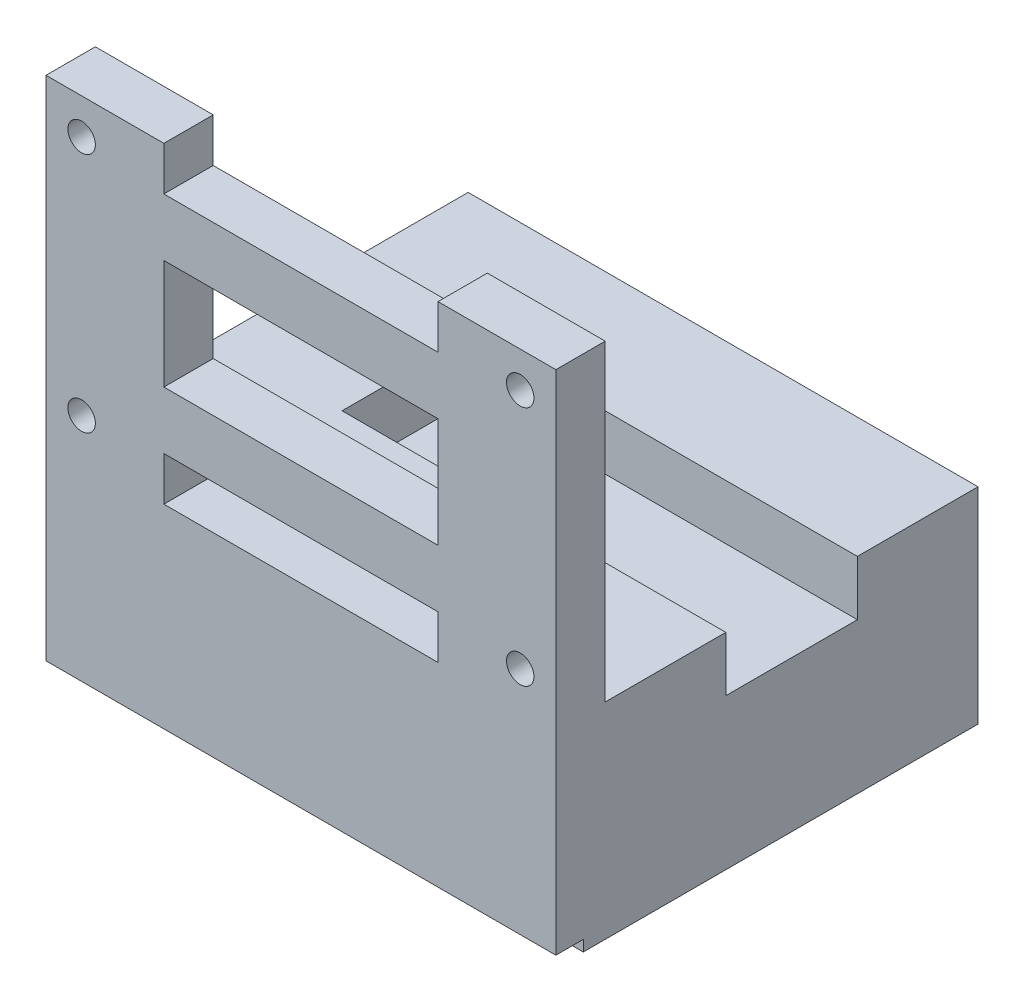
ISO-10303-21;
HEADER;
FILE_DESCRIPTION(('STEP AP214'),'2;1');
FILE_NAME('part.step','',(''),(''),'','','');
FILE_SCHEMA(('AUTOMOTIVE_DESIGN { 1 0 10303 214 1 1 1 1 }'));
ENDSEC;
DATA;
#1=APPLICATION_CONTEXT('core data for automotive mechanical design processes');
#2=APPLICATION_PROTOCOL_DEFINITION('international standard','automotive_design',2000,#1);
#3=PRODUCT_CONTEXT('',#1,'mechanical');
#4=PRODUCT('Part','Part','',(#3));
#5=PRODUCT_RELATED_PRODUCT_CATEGORY('part','',(#4));
#6=PRODUCT_DEFINITION_FORMATION('','',#4);
#7=PRODUCT_DEFINITION_CONTEXT('part definition',#1,'design');
#8=PRODUCT_DEFINITION('design','',#6,#7);
#9=PRODUCT_DEFINITION_SHAPE('','',#8);
#10=(LENGTH_UNIT() NAMED_UNIT(*) SI_UNIT(.MILLI.,.METRE.));
#11=(NAMED_UNIT(*) PLANE_ANGLE_UNIT() SI_UNIT($,.RADIAN.));
#12=(NAMED_UNIT(*) SI_UNIT($,.STERADIAN.) SOLID_ANGLE_UNIT());
#13=UNCERTAINTY_MEASURE_WITH_UNIT(LENGTH_MEASURE(1.E-05),#10,'distance_accuracy_value','');
#14=(GEOMETRIC_REPRESENTATION_CONTEXT(3) GLOBAL_UNCERTAINTY_ASSIGNED_CONTEXT((#13)) GLOBAL_UNIT_ASSIGNED_CONTEXT((#10,
#11,#12)) REPRESENTATION_CONTEXT('',''));
#15=CARTESIAN_POINT('',(0.,0.,0.));
#16=DIRECTION('',(0.,0.,1.));
#17=DIRECTION('',(1.,0.,0.));
#18=AXIS2_PLACEMENT_3D('',#15,#16,#17);
#19=CARTESIAN_POINT('',(-23.25,42.25,19.));
#20=DIRECTION('',(0.,-1.,0.));
#21=DIRECTION('',(0.,0.,-1.));
#22=AXIS2_PLACEMENT_3D('',#19,#20,#21);
#23=PLANE('',#22);
#24=DIRECTION('',(-1.,0.,0.));
#25=VECTOR('',#24,1.);
#26=CARTESIAN_POINT('',(-23.25,42.25,17.));
#27=LINE('',#26,#25);
#28=CARTESIAN_POINT('',(23.25,42.25,17.));
#29=VERTEX_POINT('',#28);
#30=CARTESIAN_POINT('',(12.5,42.25,17.));
#31=VERTEX_POINT('',#30);
#32=EDGE_CURVE('E504',#29,#31,#27,.T.);
#33=ORIENTED_EDGE('',*,*,#32,.T.);
#34=DIRECTION('',(0.,0.,-1.));
#35=VECTOR('',#34,1.);
#36=CARTESIAN_POINT('',(12.5,42.25,27.));
#37=LINE('',#36,#35);
#38=CARTESIAN_POINT('',(12.5,42.25,21.5));
#39=VERTEX_POINT('',#38);
#40=EDGE_CURVE('E329',#39,#31,#37,.T.);
#41=ORIENTED_EDGE('',*,*,#40,.F.);
#42=DIRECTION('',(-1.,0.,0.));
#43=VECTOR('',#42,1.);
#44=CARTESIAN_POINT('',(23.25,42.25,21.5));
#45=LINE('',#44,#43);
#46=CARTESIAN_POINT('',(23.25,42.25,21.5));
#47=VERTEX_POINT('',#46);
#48=EDGE_CURVE('E385',#47,#39,#45,.T.);
#49=ORIENTED_EDGE('',*,*,#48,.F.);
#50=DIRECTION('',(0.,0.,-1.));
#51=VECTOR('',#50,1.);
#52=CARTESIAN_POINT('',(23.25,42.25,19.));
#53=LINE('',#52,#51);
#54=EDGE_CURVE('E520',#47,#29,#53,.T.);
#55=ORIENTED_EDGE('',*,*,#54,.T.);
#56=EDGE_LOOP('',(#33,#41,#49,#55));
#57=FACE_BOUND('',#56,.T.);
#58=ADVANCED_FACE('F49',(#57),#23,.F.);
#59=CARTESIAN_POINT('',(0.,0.,19.));
#60=DIRECTION('',(0.,0.,-1.));
#61=DIRECTION('',(-1.,0.,0.));
#62=AXIS2_PLACEMENT_3D('',#59,#60,#61);
#63=PLANE('',#62);
#64=DIRECTION('',(1.,0.,0.));
#65=VECTOR('',#64,1.);
#66=CARTESIAN_POINT('',(23.25,-4.,19.));
#67=LINE('',#66,#65);
#68=CARTESIAN_POINT('',(-23.25,-4.,19.));
#69=VERTEX_POINT('',#68);
#70=CARTESIAN_POINT('',(23.25,-4.,19.));
#71=VERTEX_POINT('',#70);
#72=EDGE_CURVE('E402',#69,#71,#67,.T.);
#73=ORIENTED_EDGE('',*,*,#72,.F.);
#74=DIRECTION('',(0.,-1.,0.));
#75=VECTOR('',#74,1.);
#76=CARTESIAN_POINT('',(-23.25,0.,19.));
#77=LINE('',#76,#75);
#78=CARTESIAN_POINT('',(-23.25,-5.,19.));
#79=VERTEX_POINT('',#78);
#80=EDGE_CURVE('E500',#69,#79,#77,.T.);
#81=ORIENTED_EDGE('',*,*,#80,.T.);
#82=DIRECTION('',(-1.,0.,0.));
#83=VECTOR('',#82,1.);
#84=CARTESIAN_POINT('',(0.,-5.,19.));
#85=LINE('',#84,#83);
#86=CARTESIAN_POINT('',(23.25,-5.,19.));
#87=VERTEX_POINT('',#86);
#88=EDGE_CURVE('E437',#87,#79,#85,.T.);
#89=ORIENTED_EDGE('',*,*,#88,.F.);
#90=DIRECTION('',(0.,1.,0.));
#91=VECTOR('',#90,1.);
#92=CARTESIAN_POINT('',(23.25,0.,19.));
#93=LINE('',#92,#91);
#94=EDGE_CURVE('E503',#87,#71,#93,.T.);
#95=ORIENTED_EDGE('',*,*,#94,.T.);
#96=EDGE_LOOP('',(#73,#81,#89,#95));
#97=FACE_BOUND('',#96,.T.);
#98=ADVANCED_FACE('F601',(#97),#63,.F.);
#99=CARTESIAN_POINT('',(23.25,13.75,17.));
#100=DIRECTION('',(-1.,0.,0.));
#101=DIRECTION('',(0.,0.,1.));
#102=AXIS2_PLACEMENT_3D('',#99,#100,#101);
#103=PLANE('',#102);
#104=DIRECTION('',(0.,0.,-1.));
#105=VECTOR('',#104,1.);
#106=CARTESIAN_POINT('',(23.25,8.75,-6.));
#107=LINE('',#106,#105);
#108=CARTESIAN_POINT('',(23.25,8.75,6.));
#109=VERTEX_POINT('',#108);
#110=CARTESIAN_POINT('',(23.25,8.75,-6.));
#111=VERTEX_POINT('',#110);
#112=EDGE_CURVE('E460',#109,#111,#107,.T.);
#113=ORIENTED_EDGE('',*,*,#112,.F.);
#114=DIRECTION('',(0.,1.,0.));
#115=VECTOR('',#114,1.);
#116=CARTESIAN_POINT('',(23.25,8.75,6.));
#117=LINE('',#116,#115);
#118=CARTESIAN_POINT('',(23.25,13.75,6.));
#119=VERTEX_POINT('',#118);
#120=EDGE_CURVE('E487',#109,#119,#117,.T.);
#121=ORIENTED_EDGE('',*,*,#120,.T.);
#122=DIRECTION('',(0.,0.,-1.));
#123=VECTOR('',#122,1.);
#124=CARTESIAN_POINT('',(23.25,13.75,17.));
#125=LINE('',#124,#123);
#126=CARTESIAN_POINT('',(23.25,13.75,17.));
#127=VERTEX_POINT('',#126);
#128=EDGE_CURVE('E525',#127,#119,#125,.T.);
#129=ORIENTED_EDGE('',*,*,#128,.F.);
#130=DIRECTION('',(0.,1.,0.));
#131=VECTOR('',#130,1.);
#132=CARTESIAN_POINT('',(23.25,0.,17.));
#133=LINE('',#132,#131);
#134=EDGE_CURVE('E510',#127,#29,#133,.T.);
#135=ORIENTED_EDGE('',*,*,#134,.T.);
#136=ORIENTED_EDGE('',*,*,#54,.F.);
#137=DIRECTION('',(0.,-1.,0.));
#138=VECTOR('',#137,1.);
#139=CARTESIAN_POINT('',(23.25,42.25,21.5));
#140=LINE('',#139,#138);
#141=CARTESIAN_POINT('',(23.25,-4.,21.5));
#142=VERTEX_POINT('',#141);
#143=EDGE_CURVE('E389',#47,#142,#140,.T.);
#144=ORIENTED_EDGE('',*,*,#143,.T.);
#145=DIRECTION('',(0.,0.,1.));
#146=VECTOR('',#145,1.);
#147=CARTESIAN_POINT('',(23.25,-4.,19.));
#148=LINE('',#147,#146);
#149=EDGE_CURVE('E268',#71,#142,#148,.T.);
#150=ORIENTED_EDGE('',*,*,#149,.F.);
#151=ORIENTED_EDGE('',*,*,#94,.F.);
#152=DIRECTION('',(0.,0.,1.));
#153=VECTOR('',#152,1.);
#154=CARTESIAN_POINT('',(23.25,-5.,0.));
#155=LINE('',#154,#153);
#156=CARTESIAN_POINT('',(23.25,-5.,-17.));
#157=VERTEX_POINT('',#156);
#158=EDGE_CURVE('E433',#157,#87,#155,.T.);
#159=ORIENTED_EDGE('',*,*,#158,.F.);
#160=DIRECTION('',(0.,-1.,0.));
#161=VECTOR('',#160,1.);
#162=CARTESIAN_POINT('',(23.25,13.75,-17.));
#163=LINE('',#162,#161);
#164=CARTESIAN_POINT('',(23.25,13.75,-17.));
#165=VERTEX_POINT('',#164);
#166=EDGE_CURVE('E243',#165,#157,#163,.T.);
#167=ORIENTED_EDGE('',*,*,#166,.F.);
#168=CARTESIAN_POINT('',(23.25,13.75,-6.));
#169=VERTEX_POINT('',#168);
#170=EDGE_CURVE('E524',#169,#165,#125,.T.);
#171=ORIENTED_EDGE('',*,*,#170,.F.);
#172=DIRECTION('',(0.,1.,0.));
#173=VECTOR('',#172,1.);
#174=CARTESIAN_POINT('',(23.25,8.75,-6.));
#175=LINE('',#174,#173);
#176=EDGE_CURVE('E477',#111,#169,#175,.T.);
#177=ORIENTED_EDGE('',*,*,#176,.F.);
#178=EDGE_LOOP('',(#113,#121,#129,#135,#136,#144,#150,#151,#159,#167,#171,#177));
#179=FACE_BOUND('',#178,.T.);
#180=ADVANCED_FACE('F51',(#179),#103,.F.);
#181=CARTESIAN_POINT('',(-23.25,13.75,-17.));
#182=DIRECTION('',(0.,0.,1.));
#183=DIRECTION('',(1.,0.,0.));
#184=AXIS2_PLACEMENT_3D('',#181,#182,#183);
#185=PLANE('',#184);
#186=ORIENTED_EDGE('',*,*,#166,.T.);
#187=DIRECTION('',(1.,0.,0.));
#188=VECTOR('',#187,1.);
#189=CARTESIAN_POINT('',(0.,-5.,-17.));
#190=LINE('',#189,#188);
#191=CARTESIAN_POINT('',(-23.25,-5.,-17.));
#192=VERTEX_POINT('',#191);
#193=EDGE_CURVE('E429',#192,#157,#190,.T.);
#194=ORIENTED_EDGE('',*,*,#193,.F.);
#195=DIRECTION('',(0.,-1.,0.));
#196=VECTOR('',#195,1.);
#197=CARTESIAN_POINT('',(-23.25,13.75,-17.));
#198=LINE('',#197,#196);
#199=CARTESIAN_POINT('',(-23.25,13.75,-17.));
#200=VERTEX_POINT('',#199);
#201=EDGE_CURVE('E238',#200,#192,#198,.T.);
#202=ORIENTED_EDGE('',*,*,#201,.F.);
#203=DIRECTION('',(-1.,0.,0.));
#204=VECTOR('',#203,1.);
#205=CARTESIAN_POINT('',(-23.25,13.75,-17.));
#206=LINE('',#205,#204);
#207=EDGE_CURVE('E527',#165,#200,#206,.T.);
#208=ORIENTED_EDGE('',*,*,#207,.F.);
#209=EDGE_LOOP('',(#186,#194,#202,#208));
#210=FACE_BOUND('',#209,.T.);
#211=ADVANCED_FACE('F537',(#210),#185,.F.);
#212=CARTESIAN_POINT('',(-23.25,13.75,17.));
#213=DIRECTION('',(1.,0.,0.));
#214=DIRECTION('',(0.,0.,-1.));
#215=AXIS2_PLACEMENT_3D('',#212,#213,#214);
#216=PLANE('',#215);
#217=ORIENTED_EDGE('',*,*,#201,.T.);
#218=DIRECTION('',(0.,0.,-1.));
#219=VECTOR('',#218,1.);
#220=CARTESIAN_POINT('',(-23.25,-5.,0.));
#221=LINE('',#220,#219);
#222=EDGE_CURVE('E441',#79,#192,#221,.T.);
#223=ORIENTED_EDGE('',*,*,#222,.F.);
#224=ORIENTED_EDGE('',*,*,#80,.F.);
#225=DIRECTION('',(0.,0.,-1.));
#226=VECTOR('',#225,1.);
#227=CARTESIAN_POINT('',(-23.25,-4.,19.));
#228=LINE('',#227,#226);
#229=CARTESIAN_POINT('',(-23.25,-4.,21.5));
#230=VERTEX_POINT('',#229);
#231=EDGE_CURVE('E398',#230,#69,#228,.T.);
#232=ORIENTED_EDGE('',*,*,#231,.F.);
#233=DIRECTION('',(0.,-1.,0.));
#234=VECTOR('',#233,1.);
#235=CARTESIAN_POINT('',(-23.25,42.25,21.5));
#236=LINE('',#235,#234);
#237=CARTESIAN_POINT('',(-23.25,42.25,21.5));
#238=VERTEX_POINT('',#237);
#239=EDGE_CURVE('E406',#238,#230,#236,.T.);
#240=ORIENTED_EDGE('',*,*,#239,.F.);
#241=DIRECTION('',(0.,0.,-1.));
#242=VECTOR('',#241,1.);
#243=CARTESIAN_POINT('',(-23.25,42.25,19.));
#244=LINE('',#243,#242);
#245=CARTESIAN_POINT('',(-23.25,42.25,17.));
#246=VERTEX_POINT('',#245);
#247=EDGE_CURVE('E507',#238,#246,#244,.T.);
#248=ORIENTED_EDGE('',*,*,#247,.T.);
#249=DIRECTION('',(0.,-1.,0.));
#250=VECTOR('',#249,1.);
#251=CARTESIAN_POINT('',(-23.25,0.,17.));
#252=LINE('',#251,#250);
#253=CARTESIAN_POINT('',(-23.25,13.75,17.));
#254=VERTEX_POINT('',#253);
#255=EDGE_CURVE('E491',#246,#254,#252,.T.);
#256=ORIENTED_EDGE('',*,*,#255,.T.);
#257=DIRECTION('',(0.,0.,1.));
#258=VECTOR('',#257,1.);
#259=CARTESIAN_POINT('',(-23.25,13.75,17.));
#260=LINE('',#259,#258);
#261=EDGE_CURVE('E236',#200,#254,#260,.T.);
#262=ORIENTED_EDGE('',*,*,#261,.F.);
#263=EDGE_LOOP('',(#217,#223,#224,#232,#240,#248,#256,#262));
#264=FACE_BOUND('',#263,.T.);
#265=ADVANCED_FACE('F540',(#264),#216,.F.);
#266=CARTESIAN_POINT('',(0.,13.75,0.));
#267=DIRECTION('',(0.,-1.,0.));
#268=DIRECTION('',(0.,0.,-1.));
#269=AXIS2_PLACEMENT_3D('',#266,#267,#268);
#270=PLANE('',#269);
#271=ORIENTED_EDGE('',*,*,#128,.T.);
#272=DIRECTION('',(1.,0.,0.));
#273=VECTOR('',#272,1.);
#274=CARTESIAN_POINT('',(23.25,13.75,6.));
#275=LINE('',#274,#273);
#276=CARTESIAN_POINT('',(-11.75,13.75,6.00000000000001));
#277=VERTEX_POINT('',#276);
#278=EDGE_CURVE('E465',#277,#119,#275,.T.);
#279=ORIENTED_EDGE('',*,*,#278,.F.);
#280=DIRECTION('',(0.,0.,1.));
#281=VECTOR('',#280,1.);
#282=CARTESIAN_POINT('',(-11.75,13.75,-5.99999999999999));
#283=LINE('',#282,#281);
#284=CARTESIAN_POINT('',(-11.75,13.75,-5.99999999999999));
#285=VERTEX_POINT('',#284);
#286=EDGE_CURVE('E481',#285,#277,#283,.T.);
#287=ORIENTED_EDGE('',*,*,#286,.F.);
#288=DIRECTION('',(-1.,0.,0.));
#289=VECTOR('',#288,1.);
#290=CARTESIAN_POINT('',(23.25,13.75,-6.));
#291=LINE('',#290,#289);
#292=EDGE_CURVE('E445',#169,#285,#291,.T.);
#293=ORIENTED_EDGE('',*,*,#292,.F.);
#294=ORIENTED_EDGE('',*,*,#170,.T.);
#295=ORIENTED_EDGE('',*,*,#207,.T.);
#296=ORIENTED_EDGE('',*,*,#261,.T.);
#297=DIRECTION('',(1.,0.,0.));
#298=VECTOR('',#297,1.);
#299=CARTESIAN_POINT('',(-23.25,13.75,17.));
#300=LINE('',#299,#298);
#301=CARTESIAN_POINT('',(-12.5,13.75,17.));
#302=VERTEX_POINT('',#301);
#303=EDGE_CURVE('E226',#254,#302,#300,.T.);
#304=ORIENTED_EDGE('',*,*,#303,.T.);
#305=DIRECTION('',(0.,0.,-1.));
#306=VECTOR('',#305,1.);
#307=CARTESIAN_POINT('',(-12.5,13.75,27.));
#308=LINE('',#307,#306);
#309=CARTESIAN_POINT('',(-12.5,13.75,21.5));
#310=VERTEX_POINT('',#309);
#311=EDGE_CURVE('E73',#310,#302,#308,.T.);
#312=ORIENTED_EDGE('',*,*,#311,.F.);
#313=DIRECTION('',(1.,0.,0.));
#314=VECTOR('',#313,1.);
#315=CARTESIAN_POINT('',(23.25,13.75,21.5));
#316=LINE('',#315,#314);
#317=CARTESIAN_POINT('',(12.5,13.75,21.5));
#318=VERTEX_POINT('',#317);
#319=EDGE_CURVE('E294',#310,#318,#316,.T.);
#320=ORIENTED_EDGE('',*,*,#319,.T.);
#321=DIRECTION('',(0.,0.,-1.));
#322=VECTOR('',#321,1.);
#323=CARTESIAN_POINT('',(12.5,13.75,27.));
#324=LINE('',#323,#322);
#325=CARTESIAN_POINT('',(12.5,13.75,17.));
#326=VERTEX_POINT('',#325);
#327=EDGE_CURVE('E220',#318,#326,#324,.T.);
#328=ORIENTED_EDGE('',*,*,#327,.T.);
#329=EDGE_CURVE('E239',#326,#127,#300,.T.);
#330=ORIENTED_EDGE('',*,*,#329,.T.);
#331=EDGE_LOOP('',(#271,#279,#287,#293,#294,#295,#296,#304,#312,#320,#328,#330));
#332=FACE_BOUND('',#331,.T.);
#333=ADVANCED_FACE('F234',(#332),#270,.F.);
#334=CARTESIAN_POINT('',(0.,0.,17.));
#335=DIRECTION('',(0.,0.,-1.));
#336=DIRECTION('',(-1.,0.,0.));
#337=AXIS2_PLACEMENT_3D('',#334,#335,#336);
#338=PLANE('',#337);
#339=DIRECTION('',(0.,-1.,0.));
#340=VECTOR('',#339,1.);
#341=CARTESIAN_POINT('',(12.5,13.75,17.));
#342=LINE('',#341,#340);
#343=CARTESIAN_POINT('',(12.5,17.75,17.));
#344=VERTEX_POINT('',#343);
#345=EDGE_CURVE('E65',#344,#326,#342,.T.);
#346=ORIENTED_EDGE('',*,*,#345,.F.);
#347=DIRECTION('',(1.,0.,0.));
#348=VECTOR('',#347,1.);
#349=CARTESIAN_POINT('',(12.5,17.75,17.));
#350=LINE('',#349,#348);
#351=CARTESIAN_POINT('',(-12.5,17.75,17.));
#352=VERTEX_POINT('',#351);
#353=EDGE_CURVE('E229',#352,#344,#350,.T.);
#354=ORIENTED_EDGE('',*,*,#353,.F.);
#355=DIRECTION('',(0.,1.,0.));
#356=VECTOR('',#355,1.);
#357=CARTESIAN_POINT('',(-12.5,13.75,17.));
#358=LINE('',#357,#356);
#359=EDGE_CURVE('E213',#302,#352,#358,.T.);
#360=ORIENTED_EDGE('',*,*,#359,.F.);
#361=ORIENTED_EDGE('',*,*,#303,.F.);
#362=ORIENTED_EDGE('',*,*,#255,.F.);
#363=CARTESIAN_POINT('',(-12.5,42.25,17.));
#364=VERTEX_POINT('',#363);
#365=EDGE_CURVE('E513',#364,#246,#27,.T.);
#366=ORIENTED_EDGE('',*,*,#365,.F.);
#367=DIRECTION('',(0.,1.,0.));
#368=VECTOR('',#367,1.);
#369=CARTESIAN_POINT('',(-12.5,42.25,17.));
#370=LINE('',#369,#368);
#371=CARTESIAN_POINT('',(-12.5,38.25,17.));
#372=VERTEX_POINT('',#371);
#373=EDGE_CURVE('E325',#372,#364,#370,.T.);
#374=ORIENTED_EDGE('',*,*,#373,.F.);
#375=DIRECTION('',(-1.,0.,0.));
#376=VECTOR('',#375,1.);
#377=CARTESIAN_POINT('',(12.5,38.25,17.));
#378=LINE('',#377,#376);
#379=CARTESIAN_POINT('',(12.5,38.25,17.));
#380=VERTEX_POINT('',#379);
#381=EDGE_CURVE('E321',#380,#372,#378,.T.);
#382=ORIENTED_EDGE('',*,*,#381,.F.);
#383=DIRECTION('',(0.,-1.,0.));
#384=VECTOR('',#383,1.);
#385=CARTESIAN_POINT('',(12.5,42.25,17.));
#386=LINE('',#385,#384);
#387=EDGE_CURVE('E317',#31,#380,#386,.T.);
#388=ORIENTED_EDGE('',*,*,#387,.F.);
#389=ORIENTED_EDGE('',*,*,#32,.F.);
#390=ORIENTED_EDGE('',*,*,#134,.F.);
#391=ORIENTED_EDGE('',*,*,#329,.F.);
#392=EDGE_LOOP('',(#346,#354,#360,#361,#362,#366,#374,#382,#388,#389,#390,#391));
#393=FACE_BOUND('',#392,.T.);
#394=DIRECTION('',(-1.,0.,0.));
#395=VECTOR('',#394,1.);
#396=CARTESIAN_POINT('',(-12.5,33.,17.));
#397=LINE('',#396,#395);
#398=CARTESIAN_POINT('',(12.5,33.,17.));
#399=VERTEX_POINT('',#398);
#400=CARTESIAN_POINT('',(-12.5,33.,17.));
#401=VERTEX_POINT('',#400);
#402=EDGE_CURVE('E358',#399,#401,#397,.T.);
#403=ORIENTED_EDGE('',*,*,#402,.T.);
#404=DIRECTION('',(0.,-1.,0.));
#405=VECTOR('',#404,1.);
#406=CARTESIAN_POINT('',(-12.5,33.,17.));
#407=LINE('',#406,#405);
#408=CARTESIAN_POINT('',(-12.5,23.,17.));
#409=VERTEX_POINT('',#408);
#410=EDGE_CURVE('E362',#401,#409,#407,.T.);
#411=ORIENTED_EDGE('',*,*,#410,.T.);
#412=DIRECTION('',(1.,0.,0.));
#413=VECTOR('',#412,1.);
#414=CARTESIAN_POINT('',(-12.5,23.,17.));
#415=LINE('',#414,#413);
#416=CARTESIAN_POINT('',(12.5,23.,17.));
#417=VERTEX_POINT('',#416);
#418=EDGE_CURVE('E366',#409,#417,#415,.T.);
#419=ORIENTED_EDGE('',*,*,#418,.T.);
#420=DIRECTION('',(0.,1.,0.));
#421=VECTOR('',#420,1.);
#422=CARTESIAN_POINT('',(12.5,33.,17.));
#423=LINE('',#422,#421);
#424=EDGE_CURVE('E354',#417,#399,#423,.T.);
#425=ORIENTED_EDGE('',*,*,#424,.T.);
#426=EDGE_LOOP('',(#403,#411,#419,#425));
#427=FACE_BOUND('',#426,.T.);
#428=CARTESIAN_POINT('',(-20.,17.,17.));
#429=DIRECTION('',(0.,0.,-1.));
#430=DIRECTION('',(-1.,0.,0.));
#431=AXIS2_PLACEMENT_3D('',#428,#429,#430);
#432=CIRCLE('',#431,1.25);
#433=CARTESIAN_POINT('',(-21.25,17.,17.));
#434=VERTEX_POINT('',#433);
#435=EDGE_CURVE('E349',#434,#434,#432,.F.);
#436=ORIENTED_EDGE('',*,*,#435,.T.);
#437=EDGE_LOOP('',(#436));
#438=FACE_BOUND('',#437,.T.);
#439=CARTESIAN_POINT('',(20.,39.,17.));
#440=DIRECTION('',(0.,0.,-1.));
#441=DIRECTION('',(-1.,0.,0.));
#442=AXIS2_PLACEMENT_3D('',#439,#440,#441);
#443=CIRCLE('',#442,1.25);
#444=CARTESIAN_POINT('',(18.75,39.,17.));
#445=VERTEX_POINT('',#444);
#446=EDGE_CURVE('E345',#445,#445,#443,.F.);
#447=ORIENTED_EDGE('',*,*,#446,.T.);
#448=EDGE_LOOP('',(#447));
#449=FACE_BOUND('',#448,.T.);
#450=CARTESIAN_POINT('',(20.,17.,17.));
#451=DIRECTION('',(0.,0.,-1.));
#452=DIRECTION('',(-1.,0.,0.));
#453=AXIS2_PLACEMENT_3D('',#450,#451,#452);
#454=CIRCLE('',#453,1.25);
#455=CARTESIAN_POINT('',(18.75,17.,17.));
#456=VERTEX_POINT('',#455);
#457=EDGE_CURVE('E341',#456,#456,#454,.F.);
#458=ORIENTED_EDGE('',*,*,#457,.T.);
#459=EDGE_LOOP('',(#458));
#460=FACE_BOUND('',#459,.T.);
#461=CARTESIAN_POINT('',(-20.,39.,17.));
#462=DIRECTION('',(0.,0.,-1.));
#463=DIRECTION('',(-1.,0.,0.));
#464=AXIS2_PLACEMENT_3D('',#461,#462,#463);
#465=CIRCLE('',#464,1.25);
#466=CARTESIAN_POINT('',(-21.25,39.,17.));
#467=VERTEX_POINT('',#466);
#468=EDGE_CURVE('E256',#467,#467,#465,.F.);
#469=ORIENTED_EDGE('',*,*,#468,.T.);
#470=EDGE_LOOP('',(#469));
#471=FACE_BOUND('',#470,.T.);
#472=ADVANCED_FACE('F223',(#393,#427,#438,#449,#460,#471),#338,.T.);
#473=CARTESIAN_POINT('',(-12.5,42.25,21.5));
#474=VERTEX_POINT('',#473);
#475=EDGE_CURVE('E390',#474,#238,#45,.T.);
#476=ORIENTED_EDGE('',*,*,#475,.F.);
#477=DIRECTION('',(0.,0.,-1.));
#478=VECTOR('',#477,1.);
#479=CARTESIAN_POINT('',(-12.5,42.25,27.));
#480=LINE('',#479,#478);
#481=EDGE_CURVE('E332',#474,#364,#480,.T.);
#482=ORIENTED_EDGE('',*,*,#481,.T.);
#483=ORIENTED_EDGE('',*,*,#365,.T.);
#484=ORIENTED_EDGE('',*,*,#247,.F.);
#485=EDGE_LOOP('',(#476,#482,#483,#484));
#486=FACE_BOUND('',#485,.T.);
#487=ADVANCED_FACE('F589',(#486),#23,.F.);
#488=CARTESIAN_POINT('',(23.25,8.75,6.));
#489=DIRECTION('',(0.,0.,1.));
#490=DIRECTION('',(1.,0.,0.));
#491=AXIS2_PLACEMENT_3D('',#488,#489,#490);
#492=PLANE('',#491);
#493=ORIENTED_EDGE('',*,*,#278,.T.);
#494=ORIENTED_EDGE('',*,*,#120,.F.);
#495=DIRECTION('',(1.,0.,0.));
#496=VECTOR('',#495,1.);
#497=CARTESIAN_POINT('',(23.25,8.75,6.));
#498=LINE('',#497,#496);
#499=CARTESIAN_POINT('',(-11.75,8.75,6.00000000000001));
#500=VERTEX_POINT('',#499);
#501=EDGE_CURVE('E473',#500,#109,#498,.T.);
#502=ORIENTED_EDGE('',*,*,#501,.F.);
#503=DIRECTION('',(0.,1.,0.));
#504=VECTOR('',#503,1.);
#505=CARTESIAN_POINT('',(-11.75,8.75,6.00000000000001));
#506=LINE('',#505,#504);
#507=EDGE_CURVE('E492',#500,#277,#506,.T.);
#508=ORIENTED_EDGE('',*,*,#507,.T.);
#509=EDGE_LOOP('',(#493,#494,#502,#508));
#510=FACE_BOUND('',#509,.T.);
#511=ADVANCED_FACE('F563',(#510),#492,.F.);
#512=CARTESIAN_POINT('',(-11.75,8.75,-5.99999999999999));
#513=DIRECTION('',(-1.,0.,0.));
#514=DIRECTION('',(0.,0.,1.));
#515=AXIS2_PLACEMENT_3D('',#512,#513,#514);
#516=PLANE('',#515);
#517=ORIENTED_EDGE('',*,*,#286,.T.);
#518=ORIENTED_EDGE('',*,*,#507,.F.);
#519=DIRECTION('',(0.,0.,1.));
#520=VECTOR('',#519,1.);
#521=CARTESIAN_POINT('',(-11.75,8.75,-5.99999999999999));
#522=LINE('',#521,#520);
#523=CARTESIAN_POINT('',(-11.75,8.75,-5.99999999999999));
#524=VERTEX_POINT('',#523);
#525=EDGE_CURVE('E469',#524,#500,#522,.T.);
#526=ORIENTED_EDGE('',*,*,#525,.F.);
#527=DIRECTION('',(0.,1.,0.));
#528=VECTOR('',#527,1.);
#529=CARTESIAN_POINT('',(-11.75,8.75,-5.99999999999999));
#530=LINE('',#529,#528);
#531=EDGE_CURVE('E495',#524,#285,#530,.T.);
#532=ORIENTED_EDGE('',*,*,#531,.T.);
#533=EDGE_LOOP('',(#517,#518,#526,#532));
#534=FACE_BOUND('',#533,.T.);
#535=ADVANCED_FACE('F568',(#534),#516,.F.);
#536=CARTESIAN_POINT('',(23.25,8.75,-6.));
#537=DIRECTION('',(0.,0.,-1.));
#538=DIRECTION('',(-1.,0.,0.));
#539=AXIS2_PLACEMENT_3D('',#536,#537,#538);
#540=PLANE('',#539);
#541=ORIENTED_EDGE('',*,*,#292,.T.);
#542=ORIENTED_EDGE('',*,*,#531,.F.);
#543=DIRECTION('',(-1.,0.,0.));
#544=VECTOR('',#543,1.);
#545=CARTESIAN_POINT('',(23.25,8.75,-6.));
#546=LINE('',#545,#544);
#547=EDGE_CURVE('E464',#111,#524,#546,.T.);
#548=ORIENTED_EDGE('',*,*,#547,.F.);
#549=ORIENTED_EDGE('',*,*,#176,.T.);
#550=EDGE_LOOP('',(#541,#542,#548,#549));
#551=FACE_BOUND('',#550,.T.);
#552=ADVANCED_FACE('F685',(#551),#540,.F.);
#553=CARTESIAN_POINT('',(0.,8.75,0.));
#554=DIRECTION('',(0.,-1.,0.));
#555=DIRECTION('',(0.,0.,-1.));
#556=AXIS2_PLACEMENT_3D('',#553,#554,#555);
#557=PLANE('',#556);
#558=ORIENTED_EDGE('',*,*,#112,.T.);
#559=ORIENTED_EDGE('',*,*,#547,.T.);
#560=ORIENTED_EDGE('',*,*,#525,.T.);
#561=ORIENTED_EDGE('',*,*,#501,.T.);
#562=EDGE_LOOP('',(#558,#559,#560,#561));
#563=FACE_BOUND('',#562,.T.);
#564=ADVANCED_FACE('F565',(#563),#557,.F.);
#565=CARTESIAN_POINT('',(16.25,-5.,-10.));
#566=DIRECTION('',(0.,1.,0.));
#567=DIRECTION('',(0.,0.,1.));
#568=AXIS2_PLACEMENT_3D('',#565,#566,#567);
#569=CYLINDRICAL_SURFACE('',#568,2.);
#570=CARTESIAN_POINT('',(16.25,-5.,-10.));
#571=DIRECTION('',(0.,-1.,0.));
#572=DIRECTION('',(0.,0.,-1.));
#573=AXIS2_PLACEMENT_3D('',#570,#571,#572);
#574=CIRCLE('',#573,2.);
#575=CARTESIAN_POINT('',(16.25,-5.,-12.));
#576=VERTEX_POINT('',#575);
#577=EDGE_CURVE('E425',#576,#576,#574,.T.);
#578=ORIENTED_EDGE('',*,*,#577,.T.);
#579=EDGE_LOOP('',(#578));
#580=FACE_BOUND('',#579,.T.);
#581=CARTESIAN_POINT('',(16.25,0.,-10.));
#582=DIRECTION('',(0.,-1.,0.));
#583=DIRECTION('',(0.,0.,-1.));
#584=AXIS2_PLACEMENT_3D('',#581,#582,#583);
#585=CIRCLE('',#584,2.);
#586=CARTESIAN_POINT('',(16.25,0.,-12.));
#587=VERTEX_POINT('',#586);
#588=EDGE_CURVE('E417',#587,#587,#585,.T.);
#589=ORIENTED_EDGE('',*,*,#588,.F.);
#590=EDGE_LOOP('',(#589));
#591=FACE_BOUND('',#590,.T.);
#592=ADVANCED_FACE('F669',(#580,#591),#569,.F.);
#593=CARTESIAN_POINT('',(16.25,-5.,12.));
#594=DIRECTION('',(0.,1.,0.));
#595=DIRECTION('',(0.,0.,1.));
#596=AXIS2_PLACEMENT_3D('',#593,#594,#595);
#597=CYLINDRICAL_SURFACE('',#596,2.);
#598=CARTESIAN_POINT('',(16.25,-5.,12.));
#599=DIRECTION('',(0.,-1.,0.));
#600=DIRECTION('',(0.,0.,-1.));
#601=AXIS2_PLACEMENT_3D('',#598,#599,#600);
#602=CIRCLE('',#601,2.);
#603=CARTESIAN_POINT('',(16.25,-5.,10.));
#604=VERTEX_POINT('',#603);
#605=EDGE_CURVE('E421',#604,#604,#602,.T.);
#606=ORIENTED_EDGE('',*,*,#605,.T.);
#607=EDGE_LOOP('',(#606));
#608=FACE_BOUND('',#607,.T.);
#609=CARTESIAN_POINT('',(16.25,0.,12.));
#610=DIRECTION('',(0.,-1.,0.));
#611=DIRECTION('',(0.,0.,-1.));
#612=AXIS2_PLACEMENT_3D('',#609,#610,#611);
#613=CIRCLE('',#612,2.);
#614=CARTESIAN_POINT('',(16.25,0.,10.));
#615=VERTEX_POINT('',#614);
#616=EDGE_CURVE('E453',#615,#615,#613,.T.);
#617=ORIENTED_EDGE('',*,*,#616,.F.);
#618=EDGE_LOOP('',(#617));
#619=FACE_BOUND('',#618,.T.);
#620=ADVANCED_FACE('F672',(#608,#619),#597,.F.);
#621=CARTESIAN_POINT('',(-16.25,-5.,-10.));
#622=DIRECTION('',(0.,1.,0.));
#623=DIRECTION('',(0.,0.,1.));
#624=AXIS2_PLACEMENT_3D('',#621,#622,#623);
#625=CYLINDRICAL_SURFACE('',#624,2.);
#626=CARTESIAN_POINT('',(-16.25,-5.,-10.));
#627=DIRECTION('',(0.,-1.,0.));
#628=DIRECTION('',(0.,0.,-1.));
#629=AXIS2_PLACEMENT_3D('',#626,#627,#628);
#630=CIRCLE('',#629,2.);
#631=CARTESIAN_POINT('',(-16.25,-5.,-12.));
#632=VERTEX_POINT('',#631);
#633=EDGE_CURVE('E416',#632,#632,#630,.T.);
#634=ORIENTED_EDGE('',*,*,#633,.T.);
#635=EDGE_LOOP('',(#634));
#636=FACE_BOUND('',#635,.T.);
#637=CARTESIAN_POINT('',(-16.25,0.,-10.));
#638=DIRECTION('',(0.,-1.,0.));
#639=DIRECTION('',(0.,0.,-1.));
#640=AXIS2_PLACEMENT_3D('',#637,#638,#639);
#641=CIRCLE('',#640,2.);
#642=CARTESIAN_POINT('',(-16.25,0.,-12.));
#643=VERTEX_POINT('',#642);
#644=EDGE_CURVE('E449',#643,#643,#641,.T.);
#645=ORIENTED_EDGE('',*,*,#644,.F.);
#646=EDGE_LOOP('',(#645));
#647=FACE_BOUND('',#646,.T.);
#648=ADVANCED_FACE('F676',(#636,#647),#625,.F.);
#649=CARTESIAN_POINT('',(-16.25,-5.,12.));
#650=DIRECTION('',(0.,1.,0.));
#651=DIRECTION('',(0.,0.,1.));
#652=AXIS2_PLACEMENT_3D('',#649,#650,#651);
#653=CYLINDRICAL_SURFACE('',#652,2.);
#654=CARTESIAN_POINT('',(-16.25,-5.,12.));
#655=DIRECTION('',(0.,-1.,0.));
#656=DIRECTION('',(0.,0.,-1.));
#657=AXIS2_PLACEMENT_3D('',#654,#655,#656);
#658=CIRCLE('',#657,2.);
#659=CARTESIAN_POINT('',(-16.25,-5.,10.));
#660=VERTEX_POINT('',#659);
#661=EDGE_CURVE('E412',#660,#660,#658,.T.);
#662=ORIENTED_EDGE('',*,*,#661,.T.);
#663=EDGE_LOOP('',(#662));
#664=FACE_BOUND('',#663,.T.);
#665=CARTESIAN_POINT('',(-16.25,0.,12.));
#666=DIRECTION('',(0.,-1.,0.));
#667=DIRECTION('',(0.,0.,-1.));
#668=AXIS2_PLACEMENT_3D('',#665,#666,#667);
#669=CIRCLE('',#668,2.);
#670=CARTESIAN_POINT('',(-16.25,0.,10.));
#671=VERTEX_POINT('',#670);
#672=EDGE_CURVE('E409',#671,#671,#669,.T.);
#673=ORIENTED_EDGE('',*,*,#672,.F.);
#674=EDGE_LOOP('',(#673));
#675=FACE_BOUND('',#674,.T.);
#676=ADVANCED_FACE('F667',(#664,#675),#653,.F.);
#677=CARTESIAN_POINT('',(0.,-5.,0.));
#678=DIRECTION('',(0.,-1.,0.));
#679=DIRECTION('',(0.,0.,-1.));
#680=AXIS2_PLACEMENT_3D('',#677,#678,#679);
#681=PLANE('',#680);
#682=ORIENTED_EDGE('',*,*,#661,.F.);
#683=EDGE_LOOP('',(#682));
#684=FACE_BOUND('',#683,.T.);
#685=ORIENTED_EDGE('',*,*,#633,.F.);
#686=EDGE_LOOP('',(#685));
#687=FACE_BOUND('',#686,.T.);
#688=ORIENTED_EDGE('',*,*,#605,.F.);
#689=EDGE_LOOP('',(#688));
#690=FACE_BOUND('',#689,.T.);
#691=ORIENTED_EDGE('',*,*,#577,.F.);
#692=EDGE_LOOP('',(#691));
#693=FACE_BOUND('',#692,.T.);
#694=ORIENTED_EDGE('',*,*,#193,.T.);
#695=ORIENTED_EDGE('',*,*,#158,.T.);
#696=ORIENTED_EDGE('',*,*,#88,.T.);
#697=ORIENTED_EDGE('',*,*,#222,.T.);
#698=EDGE_LOOP('',(#694,#695,#696,#697));
#699=FACE_BOUND('',#698,.T.);
#700=ADVANCED_FACE('F575',(#684,#687,#690,#693,#699),#681,.T.);
#701=CARTESIAN_POINT('',(0.,0.,0.));
#702=DIRECTION('',(0.,-1.,0.));
#703=DIRECTION('',(0.,0.,-1.));
#704=AXIS2_PLACEMENT_3D('',#701,#702,#703);
#705=PLANE('',#704);
#706=ORIENTED_EDGE('',*,*,#616,.T.);
#707=EDGE_LOOP('',(#706));
#708=FACE_BOUND('',#707,.T.);
#709=ADVANCED_FACE('F666',(#708),#705,.T.);
#710=ORIENTED_EDGE('',*,*,#644,.T.);
#711=EDGE_LOOP('',(#710));
#712=FACE_BOUND('',#711,.T.);
#713=ADVANCED_FACE('F739',(#712),#705,.T.);
#714=ORIENTED_EDGE('',*,*,#672,.T.);
#715=EDGE_LOOP('',(#714));
#716=FACE_BOUND('',#715,.T.);
#717=ADVANCED_FACE('F749',(#716),#705,.T.);
#718=ORIENTED_EDGE('',*,*,#588,.T.);
#719=EDGE_LOOP('',(#718));
#720=FACE_BOUND('',#719,.T.);
#721=ADVANCED_FACE('F663',(#720),#705,.T.);
#722=CARTESIAN_POINT('',(23.25,42.25,21.5));
#723=DIRECTION('',(0.,0.,1.));
#724=DIRECTION('',(1.,0.,0.));
#725=AXIS2_PLACEMENT_3D('',#722,#723,#724);
#726=PLANE('',#725);
#727=DIRECTION('',(0.,1.,0.));
#728=VECTOR('',#727,1.);
#729=CARTESIAN_POINT('',(12.5,42.25,21.5));
#730=LINE('',#729,#728);
#731=CARTESIAN_POINT('',(12.5,17.75,21.5));
#732=VERTEX_POINT('',#731);
#733=EDGE_CURVE('E12',#318,#732,#730,.T.);
#734=ORIENTED_EDGE('',*,*,#733,.F.);
#735=ORIENTED_EDGE('',*,*,#319,.F.);
#736=DIRECTION('',(0.,-1.,0.));
#737=VECTOR('',#736,1.);
#738=CARTESIAN_POINT('',(-12.5,42.25,21.5));
#739=LINE('',#738,#737);
#740=CARTESIAN_POINT('',(-12.5,17.75,21.5));
#741=VERTEX_POINT('',#740);
#742=EDGE_CURVE('E216',#741,#310,#739,.T.);
#743=ORIENTED_EDGE('',*,*,#742,.F.);
#744=DIRECTION('',(-1.,0.,0.));
#745=VECTOR('',#744,1.);
#746=CARTESIAN_POINT('',(23.25,17.75,21.5));
#747=LINE('',#746,#745);
#748=EDGE_CURVE('E58',#732,#741,#747,.T.);
#749=ORIENTED_EDGE('',*,*,#748,.F.);
#750=EDGE_LOOP('',(#734,#735,#743,#749));
#751=FACE_BOUND('',#750,.T.);
#752=DIRECTION('',(0.,1.,0.));
#753=VECTOR('',#752,1.);
#754=CARTESIAN_POINT('',(12.5,42.25,21.5));
#755=LINE('',#754,#753);
#756=CARTESIAN_POINT('',(12.5,38.25,21.5));
#757=VERTEX_POINT('',#756);
#758=EDGE_CURVE('E291',#757,#39,#755,.T.);
#759=ORIENTED_EDGE('',*,*,#758,.F.);
#760=DIRECTION('',(1.,0.,0.));
#761=VECTOR('',#760,1.);
#762=CARTESIAN_POINT('',(23.25,38.25,21.5));
#763=LINE('',#762,#761);
#764=CARTESIAN_POINT('',(-12.5,38.25,21.5));
#765=VERTEX_POINT('',#764);
#766=EDGE_CURVE('E284',#765,#757,#763,.T.);
#767=ORIENTED_EDGE('',*,*,#766,.F.);
#768=DIRECTION('',(0.,-1.,0.));
#769=VECTOR('',#768,1.);
#770=CARTESIAN_POINT('',(-12.5,42.25,21.5));
#771=LINE('',#770,#769);
#772=EDGE_CURVE('E287',#474,#765,#771,.T.);
#773=ORIENTED_EDGE('',*,*,#772,.F.);
#774=ORIENTED_EDGE('',*,*,#475,.T.);
#775=ORIENTED_EDGE('',*,*,#239,.T.);
#776=DIRECTION('',(-1.,0.,0.));
#777=VECTOR('',#776,1.);
#778=CARTESIAN_POINT('',(23.25,-4.,21.5));
#779=LINE('',#778,#777);
#780=EDGE_CURVE('E394',#142,#230,#779,.T.);
#781=ORIENTED_EDGE('',*,*,#780,.F.);
#782=ORIENTED_EDGE('',*,*,#143,.F.);
#783=ORIENTED_EDGE('',*,*,#48,.T.);
#784=EDGE_LOOP('',(#759,#767,#773,#774,#775,#781,#782,#783));
#785=FACE_BOUND('',#784,.T.);
#786=DIRECTION('',(-1.,0.,0.));
#787=VECTOR('',#786,1.);
#788=CARTESIAN_POINT('',(23.25,23.,21.5));
#789=LINE('',#788,#787);
#790=CARTESIAN_POINT('',(12.5,23.,21.5));
#791=VERTEX_POINT('',#790);
#792=CARTESIAN_POINT('',(-12.5,23.,21.5));
#793=VERTEX_POINT('',#792);
#794=EDGE_CURVE('E276',#791,#793,#789,.T.);
#795=ORIENTED_EDGE('',*,*,#794,.T.);
#796=DIRECTION('',(0.,1.,0.));
#797=VECTOR('',#796,1.);
#798=CARTESIAN_POINT('',(-12.5,42.25,21.5));
#799=LINE('',#798,#797);
#800=CARTESIAN_POINT('',(-12.5,33.,21.5));
#801=VERTEX_POINT('',#800);
#802=EDGE_CURVE('E280',#793,#801,#799,.T.);
#803=ORIENTED_EDGE('',*,*,#802,.T.);
#804=DIRECTION('',(1.,0.,0.));
#805=VECTOR('',#804,1.);
#806=CARTESIAN_POINT('',(23.25,33.,21.5));
#807=LINE('',#806,#805);
#808=CARTESIAN_POINT('',(12.5,33.,21.5));
#809=VERTEX_POINT('',#808);
#810=EDGE_CURVE('E250',#801,#809,#807,.T.);
#811=ORIENTED_EDGE('',*,*,#810,.T.);
#812=DIRECTION('',(0.,-1.,0.));
#813=VECTOR('',#812,1.);
#814=CARTESIAN_POINT('',(12.5,42.25,21.5));
#815=LINE('',#814,#813);
#816=EDGE_CURVE('E272',#809,#791,#815,.T.);
#817=ORIENTED_EDGE('',*,*,#816,.T.);
#818=EDGE_LOOP('',(#795,#803,#811,#817));
#819=FACE_BOUND('',#818,.T.);
#820=CARTESIAN_POINT('',(-20.,17.,21.5));
#821=DIRECTION('',(0.,0.,1.));
#822=DIRECTION('',(1.,0.,0.));
#823=AXIS2_PLACEMENT_3D('',#820,#821,#822);
#824=CIRCLE('',#823,1.25);
#825=CARTESIAN_POINT('',(-18.75,17.,21.5));
#826=VERTEX_POINT('',#825);
#827=EDGE_CURVE('E264',#826,#826,#824,.F.);
#828=ORIENTED_EDGE('',*,*,#827,.T.);
#829=EDGE_LOOP('',(#828));
#830=FACE_BOUND('',#829,.T.);
#831=CARTESIAN_POINT('',(20.,39.,21.5));
#832=DIRECTION('',(0.,0.,1.));
#833=DIRECTION('',(1.,0.,0.));
#834=AXIS2_PLACEMENT_3D('',#831,#832,#833);
#835=CIRCLE('',#834,1.25);
#836=CARTESIAN_POINT('',(21.25,39.,21.5));
#837=VERTEX_POINT('',#836);
#838=EDGE_CURVE('E260',#837,#837,#835,.F.);
#839=ORIENTED_EDGE('',*,*,#838,.T.);
#840=EDGE_LOOP('',(#839));
#841=FACE_BOUND('',#840,.T.);
#842=CARTESIAN_POINT('',(20.,17.,21.5));
#843=DIRECTION('',(0.,0.,1.));
#844=DIRECTION('',(1.,0.,0.));
#845=AXIS2_PLACEMENT_3D('',#842,#843,#844);
#846=CIRCLE('',#845,1.25);
#847=CARTESIAN_POINT('',(21.25,17.,21.5));
#848=VERTEX_POINT('',#847);
#849=EDGE_CURVE('E255',#848,#848,#846,.F.);
#850=ORIENTED_EDGE('',*,*,#849,.T.);
#851=EDGE_LOOP('',(#850));
#852=FACE_BOUND('',#851,.T.);
#853=CARTESIAN_POINT('',(-20.,39.,21.5));
#854=DIRECTION('',(0.,0.,1.));
#855=DIRECTION('',(1.,0.,0.));
#856=AXIS2_PLACEMENT_3D('',#853,#854,#855);
#857=CIRCLE('',#856,1.25);
#858=CARTESIAN_POINT('',(-18.75,39.,21.5));
#859=VERTEX_POINT('',#858);
#860=EDGE_CURVE('E251',#859,#859,#857,.F.);
#861=ORIENTED_EDGE('',*,*,#860,.T.);
#862=EDGE_LOOP('',(#861));
#863=FACE_BOUND('',#862,.T.);
#864=ADVANCED_FACE('F308',(#751,#785,#819,#830,#841,#852,#863),#726,.T.);
#865=CARTESIAN_POINT('',(0.,-4.,0.));
#866=DIRECTION('',(0.,-1.,0.));
#867=DIRECTION('',(0.,0.,-1.));
#868=AXIS2_PLACEMENT_3D('',#865,#866,#867);
#869=PLANE('',#868);
#870=ORIENTED_EDGE('',*,*,#149,.T.);
#871=ORIENTED_EDGE('',*,*,#780,.T.);
#872=ORIENTED_EDGE('',*,*,#231,.T.);
#873=ORIENTED_EDGE('',*,*,#72,.T.);
#874=EDGE_LOOP('',(#870,#871,#872,#873));
#875=FACE_BOUND('',#874,.T.);
#876=ADVANCED_FACE('F580',(#875),#869,.T.);
#877=CARTESIAN_POINT('',(-20.,39.,70.));
#878=DIRECTION('',(0.,0.,-1.));
#879=DIRECTION('',(-1.,0.,0.));
#880=AXIS2_PLACEMENT_3D('',#877,#878,#879);
#881=CYLINDRICAL_SURFACE('',#880,1.25);
#882=ORIENTED_EDGE('',*,*,#860,.F.);
#883=EDGE_LOOP('',(#882));
#884=FACE_BOUND('',#883,.T.);
#885=ORIENTED_EDGE('',*,*,#468,.F.);
#886=EDGE_LOOP('',(#885));
#887=FACE_BOUND('',#886,.T.);
#888=ADVANCED_FACE('F634',(#884,#887),#881,.F.);
#889=CARTESIAN_POINT('',(20.,17.,70.));
#890=DIRECTION('',(0.,0.,-1.));
#891=DIRECTION('',(-1.,0.,0.));
#892=AXIS2_PLACEMENT_3D('',#889,#890,#891);
#893=CYLINDRICAL_SURFACE('',#892,1.25);
#894=ORIENTED_EDGE('',*,*,#849,.F.);
#895=EDGE_LOOP('',(#894));
#896=FACE_BOUND('',#895,.T.);
#897=ORIENTED_EDGE('',*,*,#457,.F.);
#898=EDGE_LOOP('',(#897));
#899=FACE_BOUND('',#898,.T.);
#900=ADVANCED_FACE('F630',(#896,#899),#893,.F.);
#901=CARTESIAN_POINT('',(20.,39.,70.));
#902=DIRECTION('',(0.,0.,-1.));
#903=DIRECTION('',(-1.,0.,0.));
#904=AXIS2_PLACEMENT_3D('',#901,#902,#903);
#905=CYLINDRICAL_SURFACE('',#904,1.25);
#906=ORIENTED_EDGE('',*,*,#838,.F.);
#907=EDGE_LOOP('',(#906));
#908=FACE_BOUND('',#907,.T.);
#909=ORIENTED_EDGE('',*,*,#446,.F.);
#910=EDGE_LOOP('',(#909));
#911=FACE_BOUND('',#910,.T.);
#912=ADVANCED_FACE('F633',(#908,#911),#905,.F.);
#913=CARTESIAN_POINT('',(-20.,17.,70.));
#914=DIRECTION('',(0.,0.,-1.));
#915=DIRECTION('',(-1.,0.,0.));
#916=AXIS2_PLACEMENT_3D('',#913,#914,#915);
#917=CYLINDRICAL_SURFACE('',#916,1.25);
#918=ORIENTED_EDGE('',*,*,#827,.F.);
#919=EDGE_LOOP('',(#918));
#920=FACE_BOUND('',#919,.T.);
#921=ORIENTED_EDGE('',*,*,#435,.F.);
#922=EDGE_LOOP('',(#921));
#923=FACE_BOUND('',#922,.T.);
#924=ADVANCED_FACE('F638',(#920,#923),#917,.F.);
#925=CARTESIAN_POINT('',(-12.5,33.,70.));
#926=DIRECTION('',(1.,0.,0.));
#927=DIRECTION('',(0.,1.,0.));
#928=AXIS2_PLACEMENT_3D('',#925,#926,#927);
#929=PLANE('',#928);
#930=DIRECTION('',(0.,0.,-1.));
#931=VECTOR('',#930,1.);
#932=CARTESIAN_POINT('',(-12.5,23.,70.));
#933=LINE('',#932,#931);
#934=EDGE_CURVE('E353',#793,#409,#933,.T.);
#935=ORIENTED_EDGE('',*,*,#934,.T.);
#936=ORIENTED_EDGE('',*,*,#410,.F.);
#937=DIRECTION('',(0.,0.,-1.));
#938=VECTOR('',#937,1.);
#939=CARTESIAN_POINT('',(-12.5,33.,70.));
#940=LINE('',#939,#938);
#941=EDGE_CURVE('E370',#801,#401,#940,.T.);
#942=ORIENTED_EDGE('',*,*,#941,.F.);
#943=ORIENTED_EDGE('',*,*,#802,.F.);
#944=EDGE_LOOP('',(#935,#936,#942,#943));
#945=FACE_BOUND('',#944,.T.);
#946=ADVANCED_FACE('F642',(#945),#929,.T.);
#947=CARTESIAN_POINT('',(-12.5,23.,70.));
#948=DIRECTION('',(0.,1.,0.));
#949=DIRECTION('',(0.,0.,1.));
#950=AXIS2_PLACEMENT_3D('',#947,#948,#949);
#951=PLANE('',#950);
#952=DIRECTION('',(0.,0.,-1.));
#953=VECTOR('',#952,1.);
#954=CARTESIAN_POINT('',(12.5,23.,70.));
#955=LINE('',#954,#953);
#956=EDGE_CURVE('E377',#791,#417,#955,.T.);
#957=ORIENTED_EDGE('',*,*,#956,.T.);
#958=ORIENTED_EDGE('',*,*,#418,.F.);
#959=ORIENTED_EDGE('',*,*,#934,.F.);
#960=ORIENTED_EDGE('',*,*,#794,.F.);
#961=EDGE_LOOP('',(#957,#958,#959,#960));
#962=FACE_BOUND('',#961,.T.);
#963=ADVANCED_FACE('F649',(#962),#951,.T.);
#964=CARTESIAN_POINT('',(12.5,33.,70.));
#965=DIRECTION('',(-1.,0.,0.));
#966=DIRECTION('',(0.,-1.,0.));
#967=AXIS2_PLACEMENT_3D('',#964,#965,#966);
#968=PLANE('',#967);
#969=DIRECTION('',(0.,0.,-1.));
#970=VECTOR('',#969,1.);
#971=CARTESIAN_POINT('',(12.5,33.,70.));
#972=LINE('',#971,#970);
#973=EDGE_CURVE('E374',#809,#399,#972,.T.);
#974=ORIENTED_EDGE('',*,*,#973,.T.);
#975=ORIENTED_EDGE('',*,*,#424,.F.);
#976=ORIENTED_EDGE('',*,*,#956,.F.);
#977=ORIENTED_EDGE('',*,*,#816,.F.);
#978=EDGE_LOOP('',(#974,#975,#976,#977));
#979=FACE_BOUND('',#978,.T.);
#980=ADVANCED_FACE('F645',(#979),#968,.T.);
#981=CARTESIAN_POINT('',(-12.5,33.,70.));
#982=DIRECTION('',(0.,-1.,0.));
#983=DIRECTION('',(0.,0.,-1.));
#984=AXIS2_PLACEMENT_3D('',#981,#982,#983);
#985=PLANE('',#984);
#986=ORIENTED_EDGE('',*,*,#941,.T.);
#987=ORIENTED_EDGE('',*,*,#402,.F.);
#988=ORIENTED_EDGE('',*,*,#973,.F.);
#989=ORIENTED_EDGE('',*,*,#810,.F.);
#990=EDGE_LOOP('',(#986,#987,#988,#989));
#991=FACE_BOUND('',#990,.T.);
#992=ADVANCED_FACE('F625',(#991),#985,.T.);
#993=CARTESIAN_POINT('',(12.5,42.25,27.));
#994=DIRECTION('',(1.,0.,0.));
#995=DIRECTION('',(0.,0.,-1.));
#996=AXIS2_PLACEMENT_3D('',#993,#994,#995);
#997=PLANE('',#996);
#998=ORIENTED_EDGE('',*,*,#758,.T.);
#999=ORIENTED_EDGE('',*,*,#40,.T.);
#1000=ORIENTED_EDGE('',*,*,#387,.T.);
#1001=DIRECTION('',(0.,0.,-1.));
#1002=VECTOR('',#1001,1.);
#1003=CARTESIAN_POINT('',(12.5,38.25,27.));
#1004=LINE('',#1003,#1002);
#1005=EDGE_CURVE('E328',#757,#380,#1004,.T.);
#1006=ORIENTED_EDGE('',*,*,#1005,.F.);
#1007=EDGE_LOOP('',(#998,#999,#1000,#1006));
#1008=FACE_BOUND('',#1007,.T.);
#1009=ADVANCED_FACE('F613',(#1008),#997,.F.);
#1010=CARTESIAN_POINT('',(-12.5,42.25,27.));
#1011=DIRECTION('',(-1.,0.,0.));
#1012=DIRECTION('',(0.,0.,1.));
#1013=AXIS2_PLACEMENT_3D('',#1010,#1011,#1012);
#1014=PLANE('',#1013);
#1015=ORIENTED_EDGE('',*,*,#772,.T.);
#1016=DIRECTION('',(0.,0.,-1.));
#1017=VECTOR('',#1016,1.);
#1018=CARTESIAN_POINT('',(-12.5,38.25,27.));
#1019=LINE('',#1018,#1017);
#1020=EDGE_CURVE('E336',#765,#372,#1019,.T.);
#1021=ORIENTED_EDGE('',*,*,#1020,.T.);
#1022=ORIENTED_EDGE('',*,*,#373,.T.);
#1023=ORIENTED_EDGE('',*,*,#481,.F.);
#1024=EDGE_LOOP('',(#1015,#1021,#1022,#1023));
#1025=FACE_BOUND('',#1024,.T.);
#1026=ADVANCED_FACE('F617',(#1025),#1014,.F.);
#1027=CARTESIAN_POINT('',(12.5,38.25,27.));
#1028=DIRECTION('',(0.,-1.,0.));
#1029=DIRECTION('',(0.,0.,-1.));
#1030=AXIS2_PLACEMENT_3D('',#1027,#1028,#1029);
#1031=PLANE('',#1030);
#1032=ORIENTED_EDGE('',*,*,#766,.T.);
#1033=ORIENTED_EDGE('',*,*,#1005,.T.);
#1034=ORIENTED_EDGE('',*,*,#381,.T.);
#1035=ORIENTED_EDGE('',*,*,#1020,.F.);
#1036=EDGE_LOOP('',(#1032,#1033,#1034,#1035));
#1037=FACE_BOUND('',#1036,.T.);
#1038=ADVANCED_FACE('F615',(#1037),#1031,.F.);
#1039=CARTESIAN_POINT('',(12.5,13.75,27.));
#1040=DIRECTION('',(1.,0.,0.));
#1041=DIRECTION('',(0.,0.,-1.));
#1042=AXIS2_PLACEMENT_3D('',#1039,#1040,#1041);
#1043=PLANE('',#1042);
#1044=ORIENTED_EDGE('',*,*,#733,.T.);
#1045=DIRECTION('',(0.,0.,-1.));
#1046=VECTOR('',#1045,1.);
#1047=CARTESIAN_POINT('',(12.5,17.75,27.));
#1048=LINE('',#1047,#1046);
#1049=EDGE_CURVE('E303',#732,#344,#1048,.T.);
#1050=ORIENTED_EDGE('',*,*,#1049,.T.);
#1051=ORIENTED_EDGE('',*,*,#345,.T.);
#1052=ORIENTED_EDGE('',*,*,#327,.F.);
#1053=EDGE_LOOP('',(#1044,#1050,#1051,#1052));
#1054=FACE_BOUND('',#1053,.T.);
#1055=ADVANCED_FACE('F311',(#1054),#1043,.F.);
#1056=CARTESIAN_POINT('',(12.5,17.75,27.));
#1057=DIRECTION('',(0.,1.,0.));
#1058=DIRECTION('',(0.,0.,1.));
#1059=AXIS2_PLACEMENT_3D('',#1056,#1057,#1058);
#1060=PLANE('',#1059);
#1061=ORIENTED_EDGE('',*,*,#748,.T.);
#1062=DIRECTION('',(0.,0.,-1.));
#1063=VECTOR('',#1062,1.);
#1064=CARTESIAN_POINT('',(-12.5,17.75,27.));
#1065=LINE('',#1064,#1063);
#1066=EDGE_CURVE('E219',#741,#352,#1065,.T.);
#1067=ORIENTED_EDGE('',*,*,#1066,.T.);
#1068=ORIENTED_EDGE('',*,*,#353,.T.);
#1069=ORIENTED_EDGE('',*,*,#1049,.F.);
#1070=EDGE_LOOP('',(#1061,#1067,#1068,#1069));
#1071=FACE_BOUND('',#1070,.T.);
#1072=ADVANCED_FACE('F302',(#1071),#1060,.F.);
#1073=CARTESIAN_POINT('',(-12.5,13.75,27.));
#1074=DIRECTION('',(-1.,0.,0.));
#1075=DIRECTION('',(0.,0.,1.));
#1076=AXIS2_PLACEMENT_3D('',#1073,#1074,#1075);
#1077=PLANE('',#1076);
#1078=ORIENTED_EDGE('',*,*,#742,.T.);
#1079=ORIENTED_EDGE('',*,*,#311,.T.);
#1080=ORIENTED_EDGE('',*,*,#359,.T.);
#1081=ORIENTED_EDGE('',*,*,#1066,.F.);
#1082=EDGE_LOOP('',(#1078,#1079,#1080,#1081));
#1083=FACE_BOUND('',#1082,.T.);
#1084=ADVANCED_FACE('F211',(#1083),#1077,.F.);
#1085=CLOSED_SHELL('',(#58,#98,#180,#211,#265,#333,#472,#487,#511,#535,#552,#564,#592,#620,#648,
#676,#700,#709,#713,#717,#721,#864,#876,#888,#900,#912,#924,#946,#963,#980,#992,#1009,#1026,
#1038,#1055,#1072,#1084));
#1086=MANIFOLD_SOLID_BREP('B2',#1085);
#1087=ADVANCED_BREP_SHAPE_REPRESENTATION('',(#18,#1086),#14);
#1088=SHAPE_DEFINITION_REPRESENTATION(#9,#1087);
ENDSEC;
END-ISO-10303-21;
